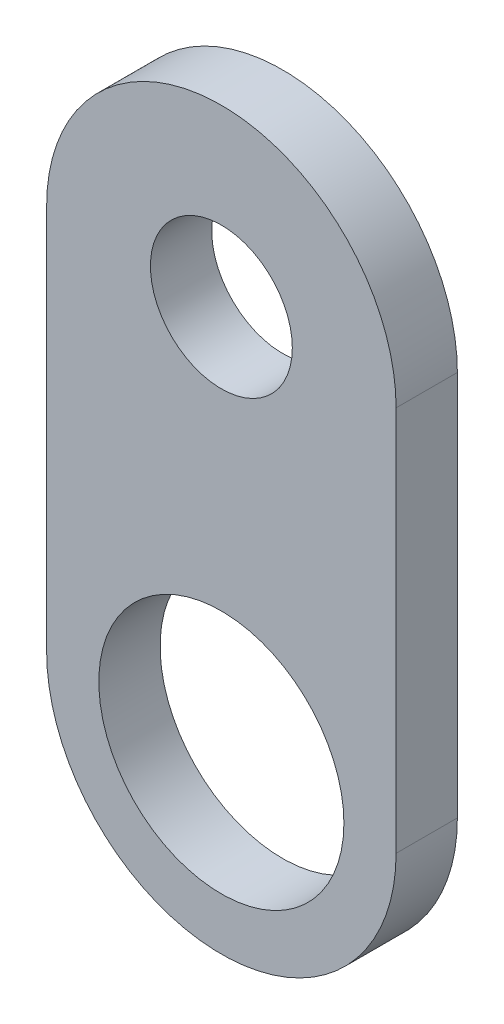
ISO-10303-21;
HEADER;
FILE_DESCRIPTION(('STEP AP214'),'2;1');
FILE_NAME('part.step','',(''),(''),'','','');
FILE_SCHEMA(('AUTOMOTIVE_DESIGN { 1 0 10303 214 1 1 1 1 }'));
ENDSEC;
DATA;
#1=APPLICATION_CONTEXT('core data for automotive mechanical design processes');
#2=APPLICATION_PROTOCOL_DEFINITION('international standard','automotive_design',2000,#1);
#3=PRODUCT_CONTEXT('',#1,'mechanical');
#4=PRODUCT('Part','Part','',(#3));
#5=PRODUCT_RELATED_PRODUCT_CATEGORY('part','',(#4));
#6=PRODUCT_DEFINITION_FORMATION('','',#4);
#7=PRODUCT_DEFINITION_CONTEXT('part definition',#1,'design');
#8=PRODUCT_DEFINITION('design','',#6,#7);
#9=PRODUCT_DEFINITION_SHAPE('','',#8);
#10=(LENGTH_UNIT() NAMED_UNIT(*) SI_UNIT(.MILLI.,.METRE.));
#11=(NAMED_UNIT(*) PLANE_ANGLE_UNIT() SI_UNIT($,.RADIAN.));
#12=(NAMED_UNIT(*) SI_UNIT($,.STERADIAN.) SOLID_ANGLE_UNIT());
#13=UNCERTAINTY_MEASURE_WITH_UNIT(LENGTH_MEASURE(1.E-05),#10,'distance_accuracy_value','');
#14=(GEOMETRIC_REPRESENTATION_CONTEXT(3) GLOBAL_UNCERTAINTY_ASSIGNED_CONTEXT((#13)) GLOBAL_UNIT_ASSIGNED_CONTEXT((#10,
#11,#12)) REPRESENTATION_CONTEXT('',''));
#15=CARTESIAN_POINT('',(0.,0.,0.));
#16=DIRECTION('',(0.,0.,1.));
#17=DIRECTION('',(1.,0.,0.));
#18=AXIS2_PLACEMENT_3D('',#15,#16,#17);
#19=CARTESIAN_POINT('',(18.1093394724875,0.,6.35));
#20=DIRECTION('',(0.,0.,-1.));
#21=DIRECTION('',(-1.,0.,0.));
#22=AXIS2_PLACEMENT_3D('',#19,#20,#21);
#23=PLANE('',#22);
#24=CARTESIAN_POINT('',(18.1093394724875,0.,6.35));
#25=DIRECTION('',(0.,0.,1.));
#26=DIRECTION('',(-1.,0.,0.));
#27=AXIS2_PLACEMENT_3D('',#24,#25,#26);
#28=CIRCLE('',#27,18.1093394724875);
#29=CARTESIAN_POINT('',(0.,0.,6.35));
#30=VERTEX_POINT('',#29);
#31=CARTESIAN_POINT('',(36.218678944975,0.,6.35));
#32=VERTEX_POINT('',#31);
#33=EDGE_CURVE('E98',#30,#32,#28,.T.);
#34=ORIENTED_EDGE('',*,*,#33,.T.);
#35=DIRECTION('',(0.,1.,0.));
#36=VECTOR('',#35,1.);
#37=CARTESIAN_POINT('',(36.218678944975,0.,6.35));
#38=LINE('',#37,#36);
#39=CARTESIAN_POINT('',(36.218678944975,39.981321055025,6.35));
#40=VERTEX_POINT('',#39);
#41=EDGE_CURVE('E93',#32,#40,#38,.T.);
#42=ORIENTED_EDGE('',*,*,#41,.T.);
#43=CARTESIAN_POINT('',(18.1093394724875,39.981321055025,6.35));
#44=DIRECTION('',(0.,0.,1.));
#45=DIRECTION('',(-1.,0.,0.));
#46=AXIS2_PLACEMENT_3D('',#43,#44,#45);
#47=CIRCLE('',#46,18.1093394724875);
#48=CARTESIAN_POINT('',(0.,39.981321055025,6.35));
#49=VERTEX_POINT('',#48);
#50=EDGE_CURVE('E96',#40,#49,#47,.T.);
#51=ORIENTED_EDGE('',*,*,#50,.T.);
#52=DIRECTION('',(0.,-1.,0.));
#53=VECTOR('',#52,1.);
#54=CARTESIAN_POINT('',(0.,0.,6.35));
#55=LINE('',#54,#53);
#56=EDGE_CURVE('E63',#49,#30,#55,.T.);
#57=ORIENTED_EDGE('',*,*,#56,.T.);
#58=EDGE_LOOP('',(#34,#42,#51,#57));
#59=FACE_BOUND('',#58,.T.);
#60=CARTESIAN_POINT('',(18.1093394724875,39.981321055025,6.35));
#61=DIRECTION('',(0.,0.,1.));
#62=DIRECTION('',(1.,0.,0.));
#63=AXIS2_PLACEMENT_3D('',#60,#61,#62);
#64=CIRCLE('',#63,7.3533);
#65=CARTESIAN_POINT('',(25.4626394724875,39.981321055025,6.35));
#66=VERTEX_POINT('',#65);
#67=EDGE_CURVE('E118',#66,#66,#64,.T.);
#68=ORIENTED_EDGE('',*,*,#67,.F.);
#69=EDGE_LOOP('',(#68));
#70=FACE_BOUND('',#69,.T.);
#71=CARTESIAN_POINT('',(18.1093394724875,0.,6.35));
#72=DIRECTION('',(0.,0.,1.));
#73=DIRECTION('',(1.,0.,0.));
#74=AXIS2_PLACEMENT_3D('',#71,#72,#73);
#75=CIRCLE('',#74,12.7);
#76=CARTESIAN_POINT('',(30.8093394724875,0.,6.35));
#77=VERTEX_POINT('',#76);
#78=EDGE_CURVE('E140',#77,#77,#75,.T.);
#79=ORIENTED_EDGE('',*,*,#78,.F.);
#80=EDGE_LOOP('',(#79));
#81=FACE_BOUND('',#80,.T.);
#82=ADVANCED_FACE('F45',(#59,#70,#81),#23,.F.);
#83=CARTESIAN_POINT('',(18.1093394724875,0.,0.));
#84=DIRECTION('',(0.,0.,-1.));
#85=DIRECTION('',(-1.,0.,0.));
#86=AXIS2_PLACEMENT_3D('',#83,#84,#85);
#87=PLANE('',#86);
#88=CARTESIAN_POINT('',(18.1093394724875,39.981321055025,0.));
#89=DIRECTION('',(0.,0.,1.));
#90=DIRECTION('',(1.,0.,0.));
#91=AXIS2_PLACEMENT_3D('',#88,#89,#90);
#92=CIRCLE('',#91,7.3533);
#93=CARTESIAN_POINT('',(25.4626394724875,39.981321055025,0.));
#94=VERTEX_POINT('',#93);
#95=EDGE_CURVE('E136',#94,#94,#92,.T.);
#96=ORIENTED_EDGE('',*,*,#95,.T.);
#97=EDGE_LOOP('',(#96));
#98=FACE_BOUND('',#97,.T.);
#99=CARTESIAN_POINT('',(18.1093394724875,0.,0.));
#100=DIRECTION('',(0.,0.,1.));
#101=DIRECTION('',(-1.,0.,0.));
#102=AXIS2_PLACEMENT_3D('',#99,#100,#101);
#103=CIRCLE('',#102,18.1093394724875);
#104=CARTESIAN_POINT('',(0.,0.,0.));
#105=VERTEX_POINT('',#104);
#106=CARTESIAN_POINT('',(36.218678944975,0.,0.));
#107=VERTEX_POINT('',#106);
#108=EDGE_CURVE('E114',#105,#107,#103,.T.);
#109=ORIENTED_EDGE('',*,*,#108,.F.);
#110=DIRECTION('',(0.,-1.,0.));
#111=VECTOR('',#110,1.);
#112=CARTESIAN_POINT('',(0.,0.,0.));
#113=LINE('',#112,#111);
#114=CARTESIAN_POINT('',(0.,39.981321055025,0.));
#115=VERTEX_POINT('',#114);
#116=EDGE_CURVE('E86',#115,#105,#113,.T.);
#117=ORIENTED_EDGE('',*,*,#116,.F.);
#118=CARTESIAN_POINT('',(18.1093394724875,39.981321055025,0.));
#119=DIRECTION('',(0.,0.,1.));
#120=DIRECTION('',(-1.,0.,0.));
#121=AXIS2_PLACEMENT_3D('',#118,#119,#120);
#122=CIRCLE('',#121,18.1093394724875);
#123=CARTESIAN_POINT('',(36.218678944975,39.981321055025,0.));
#124=VERTEX_POINT('',#123);
#125=EDGE_CURVE('E80',#124,#115,#122,.T.);
#126=ORIENTED_EDGE('',*,*,#125,.F.);
#127=DIRECTION('',(0.,1.,0.));
#128=VECTOR('',#127,1.);
#129=CARTESIAN_POINT('',(36.218678944975,0.,0.));
#130=LINE('',#129,#128);
#131=EDGE_CURVE('E103',#107,#124,#130,.T.);
#132=ORIENTED_EDGE('',*,*,#131,.F.);
#133=EDGE_LOOP('',(#109,#117,#126,#132));
#134=FACE_BOUND('',#133,.T.);
#135=CARTESIAN_POINT('',(18.1093394724875,0.,0.));
#136=DIRECTION('',(0.,0.,1.));
#137=DIRECTION('',(1.,0.,0.));
#138=AXIS2_PLACEMENT_3D('',#135,#136,#137);
#139=CIRCLE('',#138,12.7);
#140=CARTESIAN_POINT('',(30.8093394724875,0.,0.));
#141=VERTEX_POINT('',#140);
#142=EDGE_CURVE('E144',#141,#141,#139,.T.);
#143=ORIENTED_EDGE('',*,*,#142,.T.);
#144=EDGE_LOOP('',(#143));
#145=FACE_BOUND('',#144,.T.);
#146=ADVANCED_FACE('F131',(#98,#134,#145),#87,.T.);
#147=CARTESIAN_POINT('',(18.1093394724875,0.,6.35));
#148=DIRECTION('',(0.,0.,-1.));
#149=DIRECTION('',(-1.,0.,0.));
#150=AXIS2_PLACEMENT_3D('',#147,#148,#149);
#151=CYLINDRICAL_SURFACE('',#150,18.1093394724875);
#152=ORIENTED_EDGE('',*,*,#108,.T.);
#153=DIRECTION('',(0.,0.,-1.));
#154=VECTOR('',#153,1.);
#155=CARTESIAN_POINT('',(36.218678944975,0.,6.35));
#156=LINE('',#155,#154);
#157=EDGE_CURVE('E11',#32,#107,#156,.T.);
#158=ORIENTED_EDGE('',*,*,#157,.F.);
#159=ORIENTED_EDGE('',*,*,#33,.F.);
#160=DIRECTION('',(0.,0.,-1.));
#161=VECTOR('',#160,1.);
#162=CARTESIAN_POINT('',(0.,0.,6.35));
#163=LINE('',#162,#161);
#164=EDGE_CURVE('E110',#30,#105,#163,.T.);
#165=ORIENTED_EDGE('',*,*,#164,.T.);
#166=EDGE_LOOP('',(#152,#158,#159,#165));
#167=FACE_BOUND('',#166,.T.);
#168=ADVANCED_FACE('F47',(#167),#151,.T.);
#169=CARTESIAN_POINT('',(36.218678944975,0.,6.35));
#170=DIRECTION('',(-1.,0.,0.));
#171=DIRECTION('',(0.,0.,1.));
#172=AXIS2_PLACEMENT_3D('',#169,#170,#171);
#173=PLANE('',#172);
#174=ORIENTED_EDGE('',*,*,#131,.T.);
#175=DIRECTION('',(0.,0.,-1.));
#176=VECTOR('',#175,1.);
#177=CARTESIAN_POINT('',(36.218678944975,39.981321055025,6.35));
#178=LINE('',#177,#176);
#179=EDGE_CURVE('E55',#40,#124,#178,.T.);
#180=ORIENTED_EDGE('',*,*,#179,.F.);
#181=ORIENTED_EDGE('',*,*,#41,.F.);
#182=ORIENTED_EDGE('',*,*,#157,.T.);
#183=EDGE_LOOP('',(#174,#180,#181,#182));
#184=FACE_BOUND('',#183,.T.);
#185=ADVANCED_FACE('F102',(#184),#173,.F.);
#186=CARTESIAN_POINT('',(18.1093394724875,39.981321055025,6.35));
#187=DIRECTION('',(0.,0.,-1.));
#188=DIRECTION('',(-1.,0.,0.));
#189=AXIS2_PLACEMENT_3D('',#186,#187,#188);
#190=CYLINDRICAL_SURFACE('',#189,18.1093394724875);
#191=ORIENTED_EDGE('',*,*,#125,.T.);
#192=DIRECTION('',(0.,0.,-1.));
#193=VECTOR('',#192,1.);
#194=CARTESIAN_POINT('',(0.,39.981321055025,6.35));
#195=LINE('',#194,#193);
#196=EDGE_CURVE('E105',#49,#115,#195,.T.);
#197=ORIENTED_EDGE('',*,*,#196,.F.);
#198=ORIENTED_EDGE('',*,*,#50,.F.);
#199=ORIENTED_EDGE('',*,*,#179,.T.);
#200=EDGE_LOOP('',(#191,#197,#198,#199));
#201=FACE_BOUND('',#200,.T.);
#202=ADVANCED_FACE('F106',(#201),#190,.T.);
#203=CARTESIAN_POINT('',(0.,0.,6.35));
#204=DIRECTION('',(1.,0.,0.));
#205=DIRECTION('',(0.,0.,-1.));
#206=AXIS2_PLACEMENT_3D('',#203,#204,#205);
#207=PLANE('',#206);
#208=ORIENTED_EDGE('',*,*,#116,.T.);
#209=ORIENTED_EDGE('',*,*,#164,.F.);
#210=ORIENTED_EDGE('',*,*,#56,.F.);
#211=ORIENTED_EDGE('',*,*,#196,.T.);
#212=EDGE_LOOP('',(#208,#209,#210,#211));
#213=FACE_BOUND('',#212,.T.);
#214=ADVANCED_FACE('F128',(#213),#207,.F.);
#215=CARTESIAN_POINT('',(18.1093394724875,39.981321055025,6.35));
#216=DIRECTION('',(0.,0.,-1.));
#217=DIRECTION('',(-1.,0.,0.));
#218=AXIS2_PLACEMENT_3D('',#215,#216,#217);
#219=CYLINDRICAL_SURFACE('',#218,7.3533);
#220=ORIENTED_EDGE('',*,*,#67,.T.);
#221=EDGE_LOOP('',(#220));
#222=FACE_BOUND('',#221,.T.);
#223=ORIENTED_EDGE('',*,*,#95,.F.);
#224=EDGE_LOOP('',(#223));
#225=FACE_BOUND('',#224,.T.);
#226=ADVANCED_FACE('F163',(#222,#225),#219,.F.);
#227=CARTESIAN_POINT('',(18.1093394724875,0.,6.35));
#228=DIRECTION('',(0.,0.,-1.));
#229=DIRECTION('',(-1.,0.,0.));
#230=AXIS2_PLACEMENT_3D('',#227,#228,#229);
#231=CYLINDRICAL_SURFACE('',#230,12.7);
#232=ORIENTED_EDGE('',*,*,#78,.T.);
#233=EDGE_LOOP('',(#232));
#234=FACE_BOUND('',#233,.T.);
#235=ORIENTED_EDGE('',*,*,#142,.F.);
#236=EDGE_LOOP('',(#235));
#237=FACE_BOUND('',#236,.T.);
#238=ADVANCED_FACE('F152',(#234,#237),#231,.F.);
#239=CLOSED_SHELL('',(#82,#146,#168,#185,#202,#214,#226,#238));
#240=MANIFOLD_SOLID_BREP('B2',#239);
#241=ADVANCED_BREP_SHAPE_REPRESENTATION('',(#18,#240),#14);
#242=SHAPE_DEFINITION_REPRESENTATION(#9,#241);
ENDSEC;
END-ISO-10303-21;
